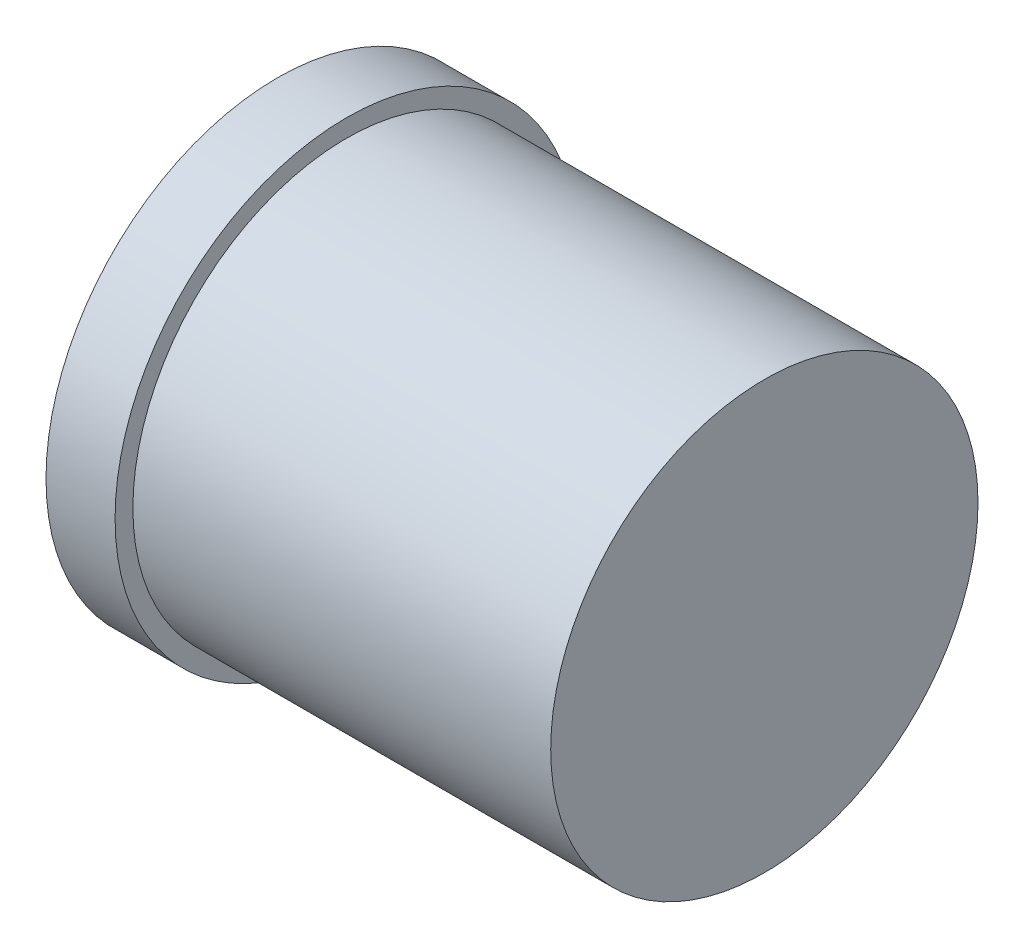
ISO-10303-21;
HEADER;
FILE_DESCRIPTION(('STEP AP214'),'2;1');
FILE_NAME('part.step','',(''),(''),'','','');
FILE_SCHEMA(('AUTOMOTIVE_DESIGN { 1 0 10303 214 1 1 1 1 }'));
ENDSEC;
DATA;
#1=APPLICATION_CONTEXT('core data for automotive mechanical design processes');
#2=APPLICATION_PROTOCOL_DEFINITION('international standard','automotive_design',2000,#1);
#3=PRODUCT_CONTEXT('',#1,'mechanical');
#4=PRODUCT('Part','Part','',(#3));
#5=PRODUCT_RELATED_PRODUCT_CATEGORY('part','',(#4));
#6=PRODUCT_DEFINITION_FORMATION('','',#4);
#7=PRODUCT_DEFINITION_CONTEXT('part definition',#1,'design');
#8=PRODUCT_DEFINITION('design','',#6,#7);
#9=PRODUCT_DEFINITION_SHAPE('','',#8);
#10=(LENGTH_UNIT() NAMED_UNIT(*) SI_UNIT(.MILLI.,.METRE.));
#11=(NAMED_UNIT(*) PLANE_ANGLE_UNIT() SI_UNIT($,.RADIAN.));
#12=(NAMED_UNIT(*) SI_UNIT($,.STERADIAN.) SOLID_ANGLE_UNIT());
#13=UNCERTAINTY_MEASURE_WITH_UNIT(LENGTH_MEASURE(1.E-05),#10,'distance_accuracy_value','');
#14=(GEOMETRIC_REPRESENTATION_CONTEXT(3) GLOBAL_UNCERTAINTY_ASSIGNED_CONTEXT((#13)) GLOBAL_UNIT_ASSIGNED_CONTEXT((#10,
#11,#12)) REPRESENTATION_CONTEXT('',''));
#15=CARTESIAN_POINT('',(0.,0.,0.));
#16=DIRECTION('',(0.,0.,1.));
#17=DIRECTION('',(1.,0.,0.));
#18=AXIS2_PLACEMENT_3D('',#15,#16,#17);
#19=CARTESIAN_POINT('',(41.2369,0.,0.));
#20=DIRECTION('',(-1.,0.,0.));
#21=DIRECTION('',(0.,0.,1.));
#22=AXIS2_PLACEMENT_3D('',#19,#20,#21);
#23=CYLINDRICAL_SURFACE('',#22,24.60625);
#24=CARTESIAN_POINT('',(41.2369,0.,0.));
#25=DIRECTION('',(-1.,0.,0.));
#26=DIRECTION('',(0.,0.,1.));
#27=AXIS2_PLACEMENT_3D('',#24,#25,#26);
#28=CIRCLE('',#27,24.60625);
#29=CARTESIAN_POINT('',(41.2369,24.5400751323728,-1.8034));
#30=VERTEX_POINT('',#29);
#31=CARTESIAN_POINT('',(41.2369,-24.5400751323728,-1.8034));
#32=VERTEX_POINT('',#31);
#33=EDGE_CURVE('E161',#30,#32,#28,.T.);
#34=ORIENTED_EDGE('',*,*,#33,.F.);
#35=DIRECTION('',(-1.,0.,0.));
#36=VECTOR('',#35,1.);
#37=CARTESIAN_POINT('',(41.2369,24.5400751323728,-1.8034));
#38=LINE('',#37,#36);
#39=CARTESIAN_POINT('',(39.4589,24.5400751323728,-1.8034));
#40=VERTEX_POINT('',#39);
#41=EDGE_CURVE('E149',#40,#30,#38,.F.);
#42=ORIENTED_EDGE('',*,*,#41,.F.);
#43=CARTESIAN_POINT('',(39.4589,0.,0.));
#44=DIRECTION('',(-1.,0.,0.));
#45=DIRECTION('',(0.,0.,1.));
#46=AXIS2_PLACEMENT_3D('',#43,#44,#45);
#47=CIRCLE('',#46,24.60625);
#48=CARTESIAN_POINT('',(39.4589,-24.5400751323728,-1.8034));
#49=VERTEX_POINT('',#48);
#50=EDGE_CURVE('E159',#40,#49,#47,.T.);
#51=ORIENTED_EDGE('',*,*,#50,.T.);
#52=DIRECTION('',(-1.,0.,0.));
#53=VECTOR('',#52,1.);
#54=CARTESIAN_POINT('',(41.2369,-24.5400751323728,-1.8034));
#55=LINE('',#54,#53);
#56=EDGE_CURVE('E284',#49,#32,#55,.F.);
#57=ORIENTED_EDGE('',*,*,#56,.T.);
#58=EDGE_LOOP('',(#34,#42,#51,#57));
#59=FACE_BOUND('',#58,.T.);
#60=ADVANCED_FACE('F34',(#59),#23,.F.);
#61=CARTESIAN_POINT('',(41.2369,0.,0.));
#62=DIRECTION('',(-1.,0.,0.));
#63=DIRECTION('',(0.,0.,1.));
#64=AXIS2_PLACEMENT_3D('',#61,#62,#63);
#65=PLANE('',#64);
#66=DIRECTION('',(0.,1.,0.));
#67=VECTOR('',#66,1.);
#68=CARTESIAN_POINT('',(41.2369,21.9605769207004,-1.8034));
#69=LINE('',#68,#67);
#70=CARTESIAN_POINT('',(41.2369,21.9605769207004,-1.8034));
#71=VERTEX_POINT('',#70);
#72=EDGE_CURVE('E49',#71,#30,#69,.T.);
#73=ORIENTED_EDGE('',*,*,#72,.T.);
#74=ORIENTED_EDGE('',*,*,#33,.T.);
#75=DIRECTION('',(0.,-1.,0.));
#76=VECTOR('',#75,1.);
#77=CARTESIAN_POINT('',(41.2369,-21.9605769207004,-1.8034));
#78=LINE('',#77,#76);
#79=CARTESIAN_POINT('',(41.2369,-21.9605769207004,-1.8034));
#80=VERTEX_POINT('',#79);
#81=EDGE_CURVE('E275',#80,#32,#78,.T.);
#82=ORIENTED_EDGE('',*,*,#81,.F.);
#83=CARTESIAN_POINT('',(41.2369,0.,0.));
#84=DIRECTION('',(-1.,0.,0.));
#85=DIRECTION('',(0.,0.,1.));
#86=AXIS2_PLACEMENT_3D('',#83,#84,#85);
#87=CIRCLE('',#86,22.0345);
#88=EDGE_CURVE('E260',#71,#80,#87,.T.);
#89=ORIENTED_EDGE('',*,*,#88,.F.);
#90=EDGE_LOOP('',(#73,#74,#82,#89));
#91=FACE_BOUND('',#90,.T.);
#92=ADVANCED_FACE('F276',(#91),#65,.T.);
#93=CARTESIAN_POINT('',(39.4589,0.,0.));
#94=DIRECTION('',(-1.,0.,0.));
#95=DIRECTION('',(0.,0.,1.));
#96=AXIS2_PLACEMENT_3D('',#93,#94,#95);
#97=PLANE('',#96);
#98=ORIENTED_EDGE('',*,*,#50,.F.);
#99=DIRECTION('',(0.,1.,0.));
#100=VECTOR('',#99,1.);
#101=CARTESIAN_POINT('',(39.4588999999996,21.9605769207004,-1.8034));
#102=LINE('',#101,#100);
#103=CARTESIAN_POINT('',(39.4588999999996,21.9605769207004,-1.8034));
#104=VERTEX_POINT('',#103);
#105=EDGE_CURVE('E146',#104,#40,#102,.T.);
#106=ORIENTED_EDGE('',*,*,#105,.F.);
#107=CARTESIAN_POINT('',(39.4589,0.,0.));
#108=DIRECTION('',(-1.,0.,0.));
#109=DIRECTION('',(0.,0.,1.));
#110=AXIS2_PLACEMENT_3D('',#107,#108,#109);
#111=CIRCLE('',#110,22.0345);
#112=CARTESIAN_POINT('',(39.4589,-21.9605769207004,-1.8034));
#113=VERTEX_POINT('',#112);
#114=EDGE_CURVE('E261',#104,#113,#111,.T.);
#115=ORIENTED_EDGE('',*,*,#114,.T.);
#116=DIRECTION('',(0.,-1.,0.));
#117=VECTOR('',#116,1.);
#118=CARTESIAN_POINT('',(39.4588999999996,-21.9605769207004,-1.8034));
#119=LINE('',#118,#117);
#120=EDGE_CURVE('E166',#113,#49,#119,.T.);
#121=ORIENTED_EDGE('',*,*,#120,.T.);
#122=EDGE_LOOP('',(#98,#106,#115,#121));
#123=FACE_BOUND('',#122,.T.);
#124=ADVANCED_FACE('F164',(#123),#97,.F.);
#125=CARTESIAN_POINT('',(39.4589,-24.5400751323728,1.8034));
#126=VERTEX_POINT('',#125);
#127=CARTESIAN_POINT('',(39.4589,24.5400751323728,1.8034));
#128=VERTEX_POINT('',#127);
#129=EDGE_CURVE('E168',#126,#128,#47,.T.);
#130=ORIENTED_EDGE('',*,*,#129,.T.);
#131=DIRECTION('',(-1.,0.,0.));
#132=VECTOR('',#131,1.);
#133=CARTESIAN_POINT('',(41.2369,24.5400751323728,1.8034));
#134=LINE('',#133,#132);
#135=CARTESIAN_POINT('',(41.2369,24.5400751323728,1.8034));
#136=VERTEX_POINT('',#135);
#137=EDGE_CURVE('E154',#136,#128,#134,.T.);
#138=ORIENTED_EDGE('',*,*,#137,.F.);
#139=CARTESIAN_POINT('',(41.2369,-24.5400751323728,1.8034));
#140=VERTEX_POINT('',#139);
#141=EDGE_CURVE('E177',#140,#136,#28,.T.);
#142=ORIENTED_EDGE('',*,*,#141,.F.);
#143=DIRECTION('',(-1.,0.,0.));
#144=VECTOR('',#143,1.);
#145=CARTESIAN_POINT('',(41.2369,-24.5400751323728,1.8034));
#146=LINE('',#145,#144);
#147=EDGE_CURVE('E338',#140,#126,#146,.T.);
#148=ORIENTED_EDGE('',*,*,#147,.T.);
#149=EDGE_LOOP('',(#130,#138,#142,#148));
#150=FACE_BOUND('',#149,.T.);
#151=ADVANCED_FACE('F320',(#150),#23,.F.);
#152=DIRECTION('',(0.,-1.,0.));
#153=VECTOR('',#152,1.);
#154=CARTESIAN_POINT('',(41.2369,21.9605769207004,1.8034));
#155=LINE('',#154,#153);
#156=CARTESIAN_POINT('',(41.2369,21.9605769207004,1.8034));
#157=VERTEX_POINT('',#156);
#158=EDGE_CURVE('E355',#136,#157,#155,.T.);
#159=ORIENTED_EDGE('',*,*,#158,.T.);
#160=CARTESIAN_POINT('',(41.2369,-21.9605769207004,1.8034));
#161=VERTEX_POINT('',#160);
#162=EDGE_CURVE('E185',#161,#157,#87,.T.);
#163=ORIENTED_EDGE('',*,*,#162,.F.);
#164=DIRECTION('',(0.,1.,0.));
#165=VECTOR('',#164,1.);
#166=CARTESIAN_POINT('',(41.2369,-21.9605769207004,1.8034));
#167=LINE('',#166,#165);
#168=EDGE_CURVE('E57',#140,#161,#167,.T.);
#169=ORIENTED_EDGE('',*,*,#168,.F.);
#170=ORIENTED_EDGE('',*,*,#141,.T.);
#171=EDGE_LOOP('',(#159,#163,#169,#170));
#172=FACE_BOUND('',#171,.T.);
#173=ADVANCED_FACE('F325',(#172),#65,.T.);
#174=CARTESIAN_POINT('',(39.4588999999996,-21.9605769207004,1.8034));
#175=VERTEX_POINT('',#174);
#176=CARTESIAN_POINT('',(39.4588999999996,21.9605769207004,1.8034));
#177=VERTEX_POINT('',#176);
#178=EDGE_CURVE('E258',#175,#177,#111,.T.);
#179=ORIENTED_EDGE('',*,*,#178,.T.);
#180=DIRECTION('',(0.,-1.,0.));
#181=VECTOR('',#180,1.);
#182=CARTESIAN_POINT('',(39.4588999999996,21.9605769207004,1.8034));
#183=LINE('',#182,#181);
#184=EDGE_CURVE('E345',#128,#177,#183,.T.);
#185=ORIENTED_EDGE('',*,*,#184,.F.);
#186=ORIENTED_EDGE('',*,*,#129,.F.);
#187=DIRECTION('',(0.,1.,0.));
#188=VECTOR('',#187,1.);
#189=CARTESIAN_POINT('',(39.4588999999996,-21.9605769207004,1.8034));
#190=LINE('',#189,#188);
#191=EDGE_CURVE('E343',#126,#175,#190,.T.);
#192=ORIENTED_EDGE('',*,*,#191,.T.);
#193=EDGE_LOOP('',(#179,#185,#186,#192));
#194=FACE_BOUND('',#193,.T.);
#195=ADVANCED_FACE('F334',(#194),#97,.F.);
#196=CARTESIAN_POINT('',(0.,0.,0.));
#197=DIRECTION('',(-1.,0.,0.));
#198=DIRECTION('',(0.,0.,1.));
#199=AXIS2_PLACEMENT_3D('',#196,#197,#198);
#200=PLANE('',#199);
#201=CARTESIAN_POINT('',(0.,0.,0.));
#202=DIRECTION('',(1.,0.,0.));
#203=DIRECTION('',(0.,0.,-1.));
#204=AXIS2_PLACEMENT_3D('',#201,#202,#203);
#205=CIRCLE('',#204,27.7271723065599);
#206=CARTESIAN_POINT('',(0.,27.6449603934905,2.1336));
#207=VERTEX_POINT('',#206);
#208=CARTESIAN_POINT('',(0.,-27.6449603934905,2.1336));
#209=VERTEX_POINT('',#208);
#210=EDGE_CURVE('E252',#207,#209,#205,.T.);
#211=ORIENTED_EDGE('',*,*,#210,.T.);
#212=DIRECTION('',(0.,1.,0.));
#213=VECTOR('',#212,1.);
#214=CARTESIAN_POINT('',(0.,-21.9309585127965,2.1336));
#215=LINE('',#214,#213);
#216=CARTESIAN_POINT('',(0.,-21.9309585127965,2.1336));
#217=VERTEX_POINT('',#216);
#218=EDGE_CURVE('E191',#209,#217,#215,.T.);
#219=ORIENTED_EDGE('',*,*,#218,.T.);
#220=CARTESIAN_POINT('',(0.,0.,0.));
#221=DIRECTION('',(-1.,0.,0.));
#222=DIRECTION('',(0.,0.,1.));
#223=AXIS2_PLACEMENT_3D('',#220,#221,#222);
#224=CIRCLE('',#223,22.0345);
#225=CARTESIAN_POINT('',(0.,21.9309585127965,2.1336));
#226=VERTEX_POINT('',#225);
#227=EDGE_CURVE('E248',#217,#226,#224,.T.);
#228=ORIENTED_EDGE('',*,*,#227,.T.);
#229=DIRECTION('',(0.,-1.,0.));
#230=VECTOR('',#229,1.);
#231=CARTESIAN_POINT('',(0.,21.9309585127965,2.1336));
#232=LINE('',#231,#230);
#233=EDGE_CURVE('E221',#207,#226,#232,.T.);
#234=ORIENTED_EDGE('',*,*,#233,.F.);
#235=EDGE_LOOP('',(#211,#219,#228,#234));
#236=FACE_BOUND('',#235,.T.);
#237=ADVANCED_FACE('F499',(#236),#200,.F.);
#238=CARTESIAN_POINT('',(26.9875,0.,0.));
#239=DIRECTION('',(-1.,0.,0.));
#240=DIRECTION('',(0.,0.,1.));
#241=AXIS2_PLACEMENT_3D('',#238,#239,#240);
#242=CYLINDRICAL_SURFACE('',#241,27.7271723065599);
#243=DIRECTION('',(-1.,0.,0.));
#244=VECTOR('',#243,1.);
#245=CARTESIAN_POINT('',(26.9875,-27.6449603934905,2.1336));
#246=LINE('',#245,#244);
#247=CARTESIAN_POINT('',(2.3876,-27.6449603934905,2.1336));
#248=VERTEX_POINT('',#247);
#249=EDGE_CURVE('E213',#209,#248,#246,.F.);
#250=ORIENTED_EDGE('',*,*,#249,.F.);
#251=ORIENTED_EDGE('',*,*,#210,.F.);
#252=DIRECTION('',(-1.,0.,0.));
#253=VECTOR('',#252,1.);
#254=CARTESIAN_POINT('',(26.9875,27.6449603934905,2.1336));
#255=LINE('',#254,#253);
#256=CARTESIAN_POINT('',(2.3876,27.6449603934905,2.1336));
#257=VERTEX_POINT('',#256);
#258=EDGE_CURVE('E236',#207,#257,#255,.F.);
#259=ORIENTED_EDGE('',*,*,#258,.T.);
#260=CARTESIAN_POINT('',(2.3876,0.,0.));
#261=DIRECTION('',(-1.,0.,0.));
#262=DIRECTION('',(0.,0.,1.));
#263=AXIS2_PLACEMENT_3D('',#260,#261,#262);
#264=CIRCLE('',#263,27.7271723065599);
#265=CARTESIAN_POINT('',(2.3876,27.6449603934905,-2.1336));
#266=VERTEX_POINT('',#265);
#267=EDGE_CURVE('E255',#257,#266,#264,.T.);
#268=ORIENTED_EDGE('',*,*,#267,.T.);
#269=DIRECTION('',(-1.,0.,0.));
#270=VECTOR('',#269,1.);
#271=CARTESIAN_POINT('',(26.9875,27.6449603934905,-2.1336));
#272=LINE('',#271,#270);
#273=CARTESIAN_POINT('',(0.,27.6449603934905,-2.1336));
#274=VERTEX_POINT('',#273);
#275=EDGE_CURVE('E239',#266,#274,#272,.T.);
#276=ORIENTED_EDGE('',*,*,#275,.T.);
#277=CARTESIAN_POINT('',(0.,-27.6449603934905,-2.1336));
#278=VERTEX_POINT('',#277);
#279=EDGE_CURVE('E251',#278,#274,#205,.T.);
#280=ORIENTED_EDGE('',*,*,#279,.F.);
#281=DIRECTION('',(-1.,0.,0.));
#282=VECTOR('',#281,1.);
#283=CARTESIAN_POINT('',(26.9875,-27.6449603934905,-2.1336));
#284=LINE('',#283,#282);
#285=CARTESIAN_POINT('',(2.3876,-27.6449603934905,-2.1336));
#286=VERTEX_POINT('',#285);
#287=EDGE_CURVE('E210',#286,#278,#284,.T.);
#288=ORIENTED_EDGE('',*,*,#287,.F.);
#289=CARTESIAN_POINT('',(2.3876,0.,0.));
#290=DIRECTION('',(-1.,0.,0.));
#291=DIRECTION('',(0.,0.,1.));
#292=AXIS2_PLACEMENT_3D('',#289,#290,#291);
#293=CIRCLE('',#292,27.7271723065599);
#294=EDGE_CURVE('E42',#286,#248,#293,.T.);
#295=ORIENTED_EDGE('',*,*,#294,.T.);
#296=EDGE_LOOP('',(#250,#251,#259,#268,#276,#280,#288,#295));
#297=FACE_BOUND('',#296,.T.);
#298=CARTESIAN_POINT('',(26.9875,0.,0.));
#299=DIRECTION('',(1.,0.,0.));
#300=DIRECTION('',(0.,0.,-1.));
#301=AXIS2_PLACEMENT_3D('',#298,#299,#300);
#302=CIRCLE('',#301,27.7271723065599);
#303=CARTESIAN_POINT('',(26.9875,0.,-27.7271723065599));
#304=VERTEX_POINT('',#303);
#305=EDGE_CURVE('E245',#304,#304,#302,.T.);
#306=ORIENTED_EDGE('',*,*,#305,.T.);
#307=EDGE_LOOP('',(#306));
#308=FACE_BOUND('',#307,.T.);
#309=ADVANCED_FACE('F671',(#297,#308),#242,.F.);
#310=CARTESIAN_POINT('',(0.,21.9309585127965,-2.1336));
#311=VERTEX_POINT('',#310);
#312=CARTESIAN_POINT('',(0.,-21.9309585127965,-2.1336));
#313=VERTEX_POINT('',#312);
#314=EDGE_CURVE('E249',#311,#313,#224,.T.);
#315=ORIENTED_EDGE('',*,*,#314,.T.);
#316=DIRECTION('',(0.,-1.,0.));
#317=VECTOR('',#316,1.);
#318=CARTESIAN_POINT('',(0.,-21.9309585127965,-2.1336));
#319=LINE('',#318,#317);
#320=EDGE_CURVE('E196',#313,#278,#319,.T.);
#321=ORIENTED_EDGE('',*,*,#320,.T.);
#322=ORIENTED_EDGE('',*,*,#279,.T.);
#323=DIRECTION('',(0.,1.,0.));
#324=VECTOR('',#323,1.);
#325=CARTESIAN_POINT('',(0.,21.9309585127965,-2.1336));
#326=LINE('',#325,#324);
#327=EDGE_CURVE('E216',#311,#274,#326,.T.);
#328=ORIENTED_EDGE('',*,*,#327,.F.);
#329=EDGE_LOOP('',(#315,#321,#322,#328));
#330=FACE_BOUND('',#329,.T.);
#331=ADVANCED_FACE('F660',(#330),#200,.F.);
#332=CARTESIAN_POINT('',(-5.5118,0.,0.));
#333=DIRECTION('',(1.,0.,0.));
#334=DIRECTION('',(0.,0.,-1.));
#335=AXIS2_PLACEMENT_3D('',#332,#333,#334);
#336=CYLINDRICAL_SURFACE('',#335,22.0345);
#337=CARTESIAN_POINT('',(-5.5118,0.,0.));
#338=DIRECTION('',(-1.,0.,0.));
#339=DIRECTION('',(0.,0.,1.));
#340=AXIS2_PLACEMENT_3D('',#337,#338,#339);
#341=CIRCLE('',#340,22.0345);
#342=CARTESIAN_POINT('',(-5.5118,0.,22.0345));
#343=VERTEX_POINT('',#342);
#344=EDGE_CURVE('E188',#343,#343,#341,.T.);
#345=ORIENTED_EDGE('',*,*,#344,.T.);
#346=EDGE_LOOP('',(#345));
#347=FACE_BOUND('',#346,.T.);
#348=ORIENTED_EDGE('',*,*,#314,.F.);
#349=DIRECTION('',(-1.,0.,0.));
#350=VECTOR('',#349,1.);
#351=CARTESIAN_POINT('',(2.3876,21.9309585127965,-2.1336));
#352=LINE('',#351,#350);
#353=CARTESIAN_POINT('',(2.3876,21.9309585127965,-2.1336));
#354=VERTEX_POINT('',#353);
#355=EDGE_CURVE('E233',#354,#311,#352,.T.);
#356=ORIENTED_EDGE('',*,*,#355,.F.);
#357=CARTESIAN_POINT('',(2.3876,0.,0.));
#358=DIRECTION('',(-1.,0.,0.));
#359=DIRECTION('',(0.,0.,1.));
#360=AXIS2_PLACEMENT_3D('',#357,#358,#359);
#361=CIRCLE('',#360,22.0345);
#362=CARTESIAN_POINT('',(2.3876,21.9309585127965,2.1336));
#363=VERTEX_POINT('',#362);
#364=EDGE_CURVE('E217',#363,#354,#361,.T.);
#365=ORIENTED_EDGE('',*,*,#364,.F.);
#366=DIRECTION('',(-1.,0.,0.));
#367=VECTOR('',#366,1.);
#368=CARTESIAN_POINT('',(2.3876,21.9309585127965,2.1336));
#369=LINE('',#368,#367);
#370=EDGE_CURVE('E226',#363,#226,#369,.T.);
#371=ORIENTED_EDGE('',*,*,#370,.T.);
#372=ORIENTED_EDGE('',*,*,#227,.F.);
#373=DIRECTION('',(-1.,0.,0.));
#374=VECTOR('',#373,1.);
#375=CARTESIAN_POINT('',(2.3876,-21.9309585127965,2.1336));
#376=LINE('',#375,#374);
#377=CARTESIAN_POINT('',(2.3876,-21.9309585127965,2.1336));
#378=VERTEX_POINT('',#377);
#379=EDGE_CURVE('E207',#378,#217,#376,.T.);
#380=ORIENTED_EDGE('',*,*,#379,.F.);
#381=CARTESIAN_POINT('',(2.3876,0.,0.));
#382=DIRECTION('',(1.,0.,0.));
#383=DIRECTION('',(0.,0.,1.));
#384=AXIS2_PLACEMENT_3D('',#381,#382,#383);
#385=CIRCLE('',#384,22.0345);
#386=CARTESIAN_POINT('',(2.3876,-21.9309585127965,-2.1336));
#387=VERTEX_POINT('',#386);
#388=EDGE_CURVE('E192',#378,#387,#385,.T.);
#389=ORIENTED_EDGE('',*,*,#388,.T.);
#390=DIRECTION('',(-1.,0.,0.));
#391=VECTOR('',#390,1.);
#392=CARTESIAN_POINT('',(2.3876,-21.9309585127965,-2.1336));
#393=LINE('',#392,#391);
#394=EDGE_CURVE('E201',#387,#313,#393,.T.);
#395=ORIENTED_EDGE('',*,*,#394,.T.);
#396=EDGE_LOOP('',(#348,#356,#365,#371,#372,#380,#389,#395));
#397=FACE_BOUND('',#396,.T.);
#398=ADVANCED_FACE('F655',(#347,#397),#336,.F.);
#399=CARTESIAN_POINT('',(26.9875,0.,0.));
#400=DIRECTION('',(1.,0.,0.));
#401=DIRECTION('',(0.,0.,-1.));
#402=AXIS2_PLACEMENT_3D('',#399,#400,#401);
#403=PLANE('',#402);
#404=ORIENTED_EDGE('',*,*,#305,.F.);
#405=EDGE_LOOP('',(#404));
#406=FACE_BOUND('',#405,.T.);
#407=CARTESIAN_POINT('',(26.9875,0.,0.));
#408=DIRECTION('',(1.,0.,0.));
#409=DIRECTION('',(0.,0.,-1.));
#410=AXIS2_PLACEMENT_3D('',#407,#408,#409);
#411=CIRCLE('',#410,22.0345);
#412=CARTESIAN_POINT('',(26.9875,0.,-22.0345));
#413=VERTEX_POINT('',#412);
#414=EDGE_CURVE('E242',#413,#413,#411,.T.);
#415=ORIENTED_EDGE('',*,*,#414,.T.);
#416=EDGE_LOOP('',(#415));
#417=FACE_BOUND('',#416,.T.);
#418=ADVANCED_FACE('F517',(#406,#417),#403,.F.);
#419=CARTESIAN_POINT('',(53.975,0.,0.));
#420=DIRECTION('',(-1.,0.,0.));
#421=DIRECTION('',(0.,0.,1.));
#422=AXIS2_PLACEMENT_3D('',#419,#420,#421);
#423=CYLINDRICAL_SURFACE('',#422,22.0345);
#424=ORIENTED_EDGE('',*,*,#114,.F.);
#425=DIRECTION('',(1.,0.,0.));
#426=VECTOR('',#425,1.);
#427=CARTESIAN_POINT('',(-500000.,21.9605769207004,-1.8034));
#428=LINE('',#427,#426);
#429=EDGE_CURVE('E150',#104,#71,#428,.T.);
#430=ORIENTED_EDGE('',*,*,#429,.T.);
#431=ORIENTED_EDGE('',*,*,#88,.T.);
#432=DIRECTION('',(1.,0.,0.));
#433=VECTOR('',#432,1.);
#434=CARTESIAN_POINT('',(-500000.,-21.9605769207004,-1.8034));
#435=LINE('',#434,#433);
#436=EDGE_CURVE('E272',#113,#80,#435,.T.);
#437=ORIENTED_EDGE('',*,*,#436,.F.);
#438=EDGE_LOOP('',(#424,#430,#431,#437));
#439=FACE_BOUND('',#438,.T.);
#440=ORIENTED_EDGE('',*,*,#178,.F.);
#441=DIRECTION('',(1.,0.,0.));
#442=VECTOR('',#441,1.);
#443=CARTESIAN_POINT('',(-500000.,-21.9605769207004,1.8034));
#444=LINE('',#443,#442);
#445=EDGE_CURVE('E281',#175,#161,#444,.T.);
#446=ORIENTED_EDGE('',*,*,#445,.T.);
#447=ORIENTED_EDGE('',*,*,#162,.T.);
#448=DIRECTION('',(1.,0.,0.));
#449=VECTOR('',#448,1.);
#450=CARTESIAN_POINT('',(-500000.,21.9605769207004,1.8034));
#451=LINE('',#450,#449);
#452=EDGE_CURVE('E162',#177,#157,#451,.T.);
#453=ORIENTED_EDGE('',*,*,#452,.F.);
#454=EDGE_LOOP('',(#440,#446,#447,#453));
#455=FACE_BOUND('',#454,.T.);
#456=ORIENTED_EDGE('',*,*,#414,.F.);
#457=EDGE_LOOP('',(#456));
#458=FACE_BOUND('',#457,.T.);
#459=CARTESIAN_POINT('',(53.975,0.,0.));
#460=DIRECTION('',(1.,0.,0.));
#461=DIRECTION('',(0.,0.,-1.));
#462=AXIS2_PLACEMENT_3D('',#459,#460,#461);
#463=CIRCLE('',#462,22.0345);
#464=CARTESIAN_POINT('',(53.975,0.,-22.0345));
#465=VERTEX_POINT('',#464);
#466=EDGE_CURVE('E169',#465,#465,#463,.T.);
#467=ORIENTED_EDGE('',*,*,#466,.T.);
#468=EDGE_LOOP('',(#467));
#469=FACE_BOUND('',#468,.T.);
#470=ADVANCED_FACE('F270',(#439,#455,#458,#469),#423,.F.);
#471=CARTESIAN_POINT('',(2.3876,21.9309585127965,-2.1336));
#472=DIRECTION('',(0.,0.,1.));
#473=DIRECTION('',(0.,-1.,0.));
#474=AXIS2_PLACEMENT_3D('',#471,#472,#473);
#475=PLANE('',#474);
#476=ORIENTED_EDGE('',*,*,#275,.F.);
#477=DIRECTION('',(0.,1.,0.));
#478=VECTOR('',#477,1.);
#479=CARTESIAN_POINT('',(2.3876,21.9309585127965,-2.1336));
#480=LINE('',#479,#478);
#481=EDGE_CURVE('E220',#354,#266,#480,.T.);
#482=ORIENTED_EDGE('',*,*,#481,.F.);
#483=ORIENTED_EDGE('',*,*,#355,.T.);
#484=ORIENTED_EDGE('',*,*,#327,.T.);
#485=EDGE_LOOP('',(#476,#482,#483,#484));
#486=FACE_BOUND('',#485,.T.);
#487=ADVANCED_FACE('F516',(#486),#475,.F.);
#488=CARTESIAN_POINT('',(2.3876,21.9309585127965,2.1336));
#489=DIRECTION('',(0.,0.,-1.));
#490=DIRECTION('',(0.,1.,0.));
#491=AXIS2_PLACEMENT_3D('',#488,#489,#490);
#492=PLANE('',#491);
#493=ORIENTED_EDGE('',*,*,#258,.F.);
#494=ORIENTED_EDGE('',*,*,#233,.T.);
#495=ORIENTED_EDGE('',*,*,#370,.F.);
#496=DIRECTION('',(0.,-1.,0.));
#497=VECTOR('',#496,1.);
#498=CARTESIAN_POINT('',(2.3876,21.9309585127965,2.1336));
#499=LINE('',#498,#497);
#500=EDGE_CURVE('E224',#257,#363,#499,.T.);
#501=ORIENTED_EDGE('',*,*,#500,.F.);
#502=EDGE_LOOP('',(#493,#494,#495,#501));
#503=FACE_BOUND('',#502,.T.);
#504=ADVANCED_FACE('F558',(#503),#492,.F.);
#505=CARTESIAN_POINT('',(2.3876,0.,0.));
#506=DIRECTION('',(-1.,0.,0.));
#507=DIRECTION('',(0.,0.,1.));
#508=AXIS2_PLACEMENT_3D('',#505,#506,#507);
#509=PLANE('',#508);
#510=ORIENTED_EDGE('',*,*,#267,.F.);
#511=ORIENTED_EDGE('',*,*,#500,.T.);
#512=ORIENTED_EDGE('',*,*,#364,.T.);
#513=ORIENTED_EDGE('',*,*,#481,.T.);
#514=EDGE_LOOP('',(#510,#511,#512,#513));
#515=FACE_BOUND('',#514,.T.);
#516=ADVANCED_FACE('F566',(#515),#509,.F.);
#517=CARTESIAN_POINT('',(2.3876,-21.9309585127965,2.1336));
#518=DIRECTION('',(0.,0.,1.));
#519=DIRECTION('',(0.,-1.,0.));
#520=AXIS2_PLACEMENT_3D('',#517,#518,#519);
#521=PLANE('',#520);
#522=ORIENTED_EDGE('',*,*,#218,.F.);
#523=ORIENTED_EDGE('',*,*,#249,.T.);
#524=DIRECTION('',(0.,1.,0.));
#525=VECTOR('',#524,1.);
#526=CARTESIAN_POINT('',(2.3876,-21.9309585127965,2.1336));
#527=LINE('',#526,#525);
#528=EDGE_CURVE('E195',#248,#378,#527,.T.);
#529=ORIENTED_EDGE('',*,*,#528,.T.);
#530=ORIENTED_EDGE('',*,*,#379,.T.);
#531=EDGE_LOOP('',(#522,#523,#529,#530));
#532=FACE_BOUND('',#531,.T.);
#533=ADVANCED_FACE('F574',(#532),#521,.T.);
#534=CARTESIAN_POINT('',(2.3876,-21.9309585127965,-2.1336));
#535=DIRECTION('',(0.,0.,-1.));
#536=DIRECTION('',(0.,1.,0.));
#537=AXIS2_PLACEMENT_3D('',#534,#535,#536);
#538=PLANE('',#537);
#539=DIRECTION('',(0.,-1.,0.));
#540=VECTOR('',#539,1.);
#541=CARTESIAN_POINT('',(2.3876,-21.9309585127965,-2.1336));
#542=LINE('',#541,#540);
#543=EDGE_CURVE('E198',#387,#286,#542,.T.);
#544=ORIENTED_EDGE('',*,*,#543,.T.);
#545=ORIENTED_EDGE('',*,*,#287,.T.);
#546=ORIENTED_EDGE('',*,*,#320,.F.);
#547=ORIENTED_EDGE('',*,*,#394,.F.);
#548=EDGE_LOOP('',(#544,#545,#546,#547));
#549=FACE_BOUND('',#548,.T.);
#550=ADVANCED_FACE('F583',(#549),#538,.T.);
#551=CARTESIAN_POINT('',(2.3876,0.,0.));
#552=DIRECTION('',(-1.,0.,0.));
#553=DIRECTION('',(0.,0.,1.));
#554=AXIS2_PLACEMENT_3D('',#551,#552,#553);
#555=PLANE('',#554);
#556=ORIENTED_EDGE('',*,*,#294,.F.);
#557=ORIENTED_EDGE('',*,*,#543,.F.);
#558=ORIENTED_EDGE('',*,*,#388,.F.);
#559=ORIENTED_EDGE('',*,*,#528,.F.);
#560=EDGE_LOOP('',(#556,#557,#558,#559));
#561=FACE_BOUND('',#560,.T.);
#562=ADVANCED_FACE('F592',(#561),#555,.F.);
#563=CARTESIAN_POINT('',(-7.7216,0.,0.));
#564=DIRECTION('',(-1.,0.,0.));
#565=DIRECTION('',(0.,0.,1.));
#566=AXIS2_PLACEMENT_3D('',#563,#564,#565);
#567=PLANE('',#566);
#568=CARTESIAN_POINT('',(-7.7216,0.,0.));
#569=DIRECTION('',(-1.,0.,0.));
#570=DIRECTION('',(0.,0.,1.));
#571=AXIS2_PLACEMENT_3D('',#568,#569,#570);
#572=CIRCLE('',#571,31.75);
#573=CARTESIAN_POINT('',(-7.7216,0.,-31.75));
#574=VERTEX_POINT('',#573);
#575=EDGE_CURVE('E11',#574,#574,#572,.F.);
#576=ORIENTED_EDGE('',*,*,#575,.F.);
#577=EDGE_LOOP('',(#576));
#578=FACE_BOUND('',#577,.T.);
#579=CARTESIAN_POINT('',(-7.7216,0.,0.));
#580=DIRECTION('',(-1.,0.,0.));
#581=DIRECTION('',(0.,0.,1.));
#582=AXIS2_PLACEMENT_3D('',#579,#580,#581);
#583=CIRCLE('',#582,17.526);
#584=CARTESIAN_POINT('',(-7.7216,0.,17.526));
#585=VERTEX_POINT('',#584);
#586=EDGE_CURVE('E178',#585,#585,#583,.T.);
#587=ORIENTED_EDGE('',*,*,#586,.F.);
#588=EDGE_LOOP('',(#587));
#589=FACE_BOUND('',#588,.T.);
#590=ADVANCED_FACE('F451',(#578,#589),#567,.T.);
#591=CARTESIAN_POINT('',(-5.5118,0.,0.));
#592=DIRECTION('',(-1.,0.,0.));
#593=DIRECTION('',(0.,0.,1.));
#594=AXIS2_PLACEMENT_3D('',#591,#592,#593);
#595=PLANE('',#594);
#596=ORIENTED_EDGE('',*,*,#344,.F.);
#597=EDGE_LOOP('',(#596));
#598=FACE_BOUND('',#597,.T.);
#599=CARTESIAN_POINT('',(-5.5118,0.,0.));
#600=DIRECTION('',(-1.,0.,0.));
#601=DIRECTION('',(0.,0.,1.));
#602=AXIS2_PLACEMENT_3D('',#599,#600,#601);
#603=CIRCLE('',#602,17.526);
#604=CARTESIAN_POINT('',(-5.5118,0.,17.526));
#605=VERTEX_POINT('',#604);
#606=EDGE_CURVE('E182',#605,#605,#603,.T.);
#607=ORIENTED_EDGE('',*,*,#606,.T.);
#608=EDGE_LOOP('',(#607));
#609=FACE_BOUND('',#608,.T.);
#610=ADVANCED_FACE('F606',(#598,#609),#595,.F.);
#611=CARTESIAN_POINT('',(-7.7216,0.,0.));
#612=DIRECTION('',(1.,0.,0.));
#613=DIRECTION('',(0.,0.,-1.));
#614=AXIS2_PLACEMENT_3D('',#611,#612,#613);
#615=CYLINDRICAL_SURFACE('',#614,17.526);
#616=ORIENTED_EDGE('',*,*,#586,.T.);
#617=EDGE_LOOP('',(#616));
#618=FACE_BOUND('',#617,.T.);
#619=ORIENTED_EDGE('',*,*,#606,.F.);
#620=EDGE_LOOP('',(#619));
#621=FACE_BOUND('',#620,.T.);
#622=ADVANCED_FACE('F315',(#618,#621),#615,.F.);
#623=CARTESIAN_POINT('',(53.975,0.,0.));
#624=DIRECTION('',(1.,0.,0.));
#625=DIRECTION('',(0.,0.,-1.));
#626=AXIS2_PLACEMENT_3D('',#623,#624,#625);
#627=PLANE('',#626);
#628=ORIENTED_EDGE('',*,*,#466,.F.);
#629=EDGE_LOOP('',(#628));
#630=FACE_BOUND('',#629,.T.);
#631=CARTESIAN_POINT('',(53.975,0.,0.));
#632=DIRECTION('',(1.,0.,0.));
#633=DIRECTION('',(0.,0.,-1.));
#634=AXIS2_PLACEMENT_3D('',#631,#632,#633);
#635=CIRCLE('',#634,6.5151);
#636=CARTESIAN_POINT('',(53.975,0.,-6.5151));
#637=VERTEX_POINT('',#636);
#638=EDGE_CURVE('E173',#637,#637,#635,.T.);
#639=ORIENTED_EDGE('',*,*,#638,.T.);
#640=EDGE_LOOP('',(#639));
#641=FACE_BOUND('',#640,.T.);
#642=ADVANCED_FACE('F301',(#630,#641),#627,.F.);
#643=CARTESIAN_POINT('',(59.944,0.,0.));
#644=DIRECTION('',(-1.,0.,0.));
#645=DIRECTION('',(0.,0.,1.));
#646=AXIS2_PLACEMENT_3D('',#643,#644,#645);
#647=CYLINDRICAL_SURFACE('',#646,6.5151);
#648=CARTESIAN_POINT('',(59.944,0.,0.));
#649=DIRECTION('',(1.,0.,0.));
#650=DIRECTION('',(0.,0.,-1.));
#651=AXIS2_PLACEMENT_3D('',#648,#649,#650);
#652=CIRCLE('',#651,6.5151);
#653=CARTESIAN_POINT('',(59.944,0.,-6.5151));
#654=VERTEX_POINT('',#653);
#655=EDGE_CURVE('E295',#654,#654,#652,.T.);
#656=ORIENTED_EDGE('',*,*,#655,.T.);
#657=EDGE_LOOP('',(#656));
#658=FACE_BOUND('',#657,.T.);
#659=ORIENTED_EDGE('',*,*,#638,.F.);
#660=EDGE_LOOP('',(#659));
#661=FACE_BOUND('',#660,.T.);
#662=ADVANCED_FACE('F303',(#658,#661),#647,.F.);
#663=CARTESIAN_POINT('',(59.944,0.,0.));
#664=DIRECTION('',(1.,0.,0.));
#665=DIRECTION('',(0.,0.,-1.));
#666=AXIS2_PLACEMENT_3D('',#663,#664,#665);
#667=PLANE('',#666);
#668=ORIENTED_EDGE('',*,*,#655,.F.);
#669=EDGE_LOOP('',(#668));
#670=FACE_BOUND('',#669,.T.);
#671=CARTESIAN_POINT('',(59.944,0.,0.));
#672=DIRECTION('',(1.,0.,0.));
#673=DIRECTION('',(0.,0.,-1.));
#674=AXIS2_PLACEMENT_3D('',#671,#672,#673);
#675=CIRCLE('',#674,5.0165);
#676=CARTESIAN_POINT('',(59.944,0.,-5.0165));
#677=VERTEX_POINT('',#676);
#678=EDGE_CURVE('E292',#677,#677,#675,.T.);
#679=ORIENTED_EDGE('',*,*,#678,.T.);
#680=EDGE_LOOP('',(#679));
#681=FACE_BOUND('',#680,.T.);
#682=ADVANCED_FACE('F305',(#670,#681),#667,.F.);
#683=CARTESIAN_POINT('',(65.2018,0.,0.));
#684=DIRECTION('',(-1.,0.,0.));
#685=DIRECTION('',(0.,0.,1.));
#686=AXIS2_PLACEMENT_3D('',#683,#684,#685);
#687=CYLINDRICAL_SURFACE('',#686,5.0165);
#688=CARTESIAN_POINT('',(65.2018,0.,0.));
#689=DIRECTION('',(1.,0.,0.));
#690=DIRECTION('',(0.,0.,-1.));
#691=AXIS2_PLACEMENT_3D('',#688,#689,#690);
#692=CIRCLE('',#691,5.0165);
#693=CARTESIAN_POINT('',(65.2018,0.,-5.0165));
#694=VERTEX_POINT('',#693);
#695=EDGE_CURVE('E289',#694,#694,#692,.T.);
#696=ORIENTED_EDGE('',*,*,#695,.T.);
#697=EDGE_LOOP('',(#696));
#698=FACE_BOUND('',#697,.T.);
#699=ORIENTED_EDGE('',*,*,#678,.F.);
#700=EDGE_LOOP('',(#699));
#701=FACE_BOUND('',#700,.T.);
#702=ADVANCED_FACE('F312',(#698,#701),#687,.F.);
#703=CARTESIAN_POINT('',(65.2018,0.,0.));
#704=DIRECTION('',(1.,0.,0.));
#705=DIRECTION('',(0.,0.,-1.));
#706=AXIS2_PLACEMENT_3D('',#703,#704,#705);
#707=PLANE('',#706);
#708=ORIENTED_EDGE('',*,*,#695,.F.);
#709=EDGE_LOOP('',(#708));
#710=FACE_BOUND('',#709,.T.);
#711=ADVANCED_FACE('F398',(#710),#707,.F.);
#712=CARTESIAN_POINT('',(-500000.,-21.9605769207004,-1.8034));
#713=DIRECTION('',(0.,0.,1.));
#714=DIRECTION('',(0.,-1.,0.));
#715=AXIS2_PLACEMENT_3D('',#712,#713,#714);
#716=PLANE('',#715);
#717=ORIENTED_EDGE('',*,*,#120,.F.);
#718=ORIENTED_EDGE('',*,*,#436,.T.);
#719=ORIENTED_EDGE('',*,*,#81,.T.);
#720=ORIENTED_EDGE('',*,*,#56,.F.);
#721=EDGE_LOOP('',(#717,#718,#719,#720));
#722=FACE_BOUND('',#721,.T.);
#723=ADVANCED_FACE('F280',(#722),#716,.F.);
#724=CARTESIAN_POINT('',(-500000.,-21.9605769207004,1.8034));
#725=DIRECTION('',(0.,0.,-1.));
#726=DIRECTION('',(0.,1.,0.));
#727=AXIS2_PLACEMENT_3D('',#724,#725,#726);
#728=PLANE('',#727);
#729=ORIENTED_EDGE('',*,*,#191,.F.);
#730=ORIENTED_EDGE('',*,*,#147,.F.);
#731=ORIENTED_EDGE('',*,*,#168,.T.);
#732=ORIENTED_EDGE('',*,*,#445,.F.);
#733=EDGE_LOOP('',(#729,#730,#731,#732));
#734=FACE_BOUND('',#733,.T.);
#735=ADVANCED_FACE('F347',(#734),#728,.F.);
#736=CARTESIAN_POINT('',(-500000.,21.9605769207004,-1.8034));
#737=DIRECTION('',(0.,0.,-1.));
#738=DIRECTION('',(0.,1.,0.));
#739=AXIS2_PLACEMENT_3D('',#736,#737,#738);
#740=PLANE('',#739);
#741=ORIENTED_EDGE('',*,*,#429,.F.);
#742=ORIENTED_EDGE('',*,*,#105,.T.);
#743=ORIENTED_EDGE('',*,*,#41,.T.);
#744=ORIENTED_EDGE('',*,*,#72,.F.);
#745=EDGE_LOOP('',(#741,#742,#743,#744));
#746=FACE_BOUND('',#745,.T.);
#747=ADVANCED_FACE('F148',(#746),#740,.T.);
#748=CARTESIAN_POINT('',(-500000.,21.9605769207004,1.8034));
#749=DIRECTION('',(0.,0.,1.));
#750=DIRECTION('',(0.,-1.,0.));
#751=AXIS2_PLACEMENT_3D('',#748,#749,#750);
#752=PLANE('',#751);
#753=ORIENTED_EDGE('',*,*,#137,.T.);
#754=ORIENTED_EDGE('',*,*,#184,.T.);
#755=ORIENTED_EDGE('',*,*,#452,.T.);
#756=ORIENTED_EDGE('',*,*,#158,.F.);
#757=EDGE_LOOP('',(#753,#754,#755,#756));
#758=FACE_BOUND('',#757,.T.);
#759=ADVANCED_FACE('F386',(#758),#752,.T.);
#760=CARTESIAN_POINT('',(-7.7216,0.,0.));
#761=DIRECTION('',(-1.,0.,0.));
#762=DIRECTION('',(0.,0.,1.));
#763=AXIS2_PLACEMENT_3D('',#760,#761,#762);
#764=PLANE('',#763);
#765=CARTESIAN_POINT('',(-7.7216,0.,0.));
#766=DIRECTION('',(-1.,0.,0.));
#767=DIRECTION('',(0.,0.,1.));
#768=AXIS2_PLACEMENT_3D('',#765,#766,#767);
#769=CIRCLE('',#768,41.275);
#770=CARTESIAN_POINT('',(-7.7216,0.,-41.275));
#771=VERTEX_POINT('',#770);
#772=EDGE_CURVE('E362',#771,#771,#769,.T.);
#773=ORIENTED_EDGE('',*,*,#772,.F.);
#774=EDGE_LOOP('',(#773));
#775=FACE_BOUND('',#774,.T.);
#776=CARTESIAN_POINT('',(-7.7216,0.,0.));
#777=DIRECTION('',(-1.,0.,0.));
#778=DIRECTION('',(0.,0.,1.));
#779=AXIS2_PLACEMENT_3D('',#776,#777,#778);
#780=CIRCLE('',#779,38.1);
#781=CARTESIAN_POINT('',(-7.7216,0.,38.1));
#782=VERTEX_POINT('',#781);
#783=EDGE_CURVE('E181',#782,#782,#780,.T.);
#784=ORIENTED_EDGE('',*,*,#783,.T.);
#785=EDGE_LOOP('',(#784));
#786=FACE_BOUND('',#785,.T.);
#787=ADVANCED_FACE('F377',(#775,#786),#764,.F.);
#788=CARTESIAN_POINT('',(-20.0406,0.,0.));
#789=DIRECTION('',(-1.,0.,0.));
#790=DIRECTION('',(0.,0.,1.));
#791=AXIS2_PLACEMENT_3D('',#788,#789,#790);
#792=PLANE('',#791);
#793=CARTESIAN_POINT('',(-20.0406,0.,0.));
#794=DIRECTION('',(-1.,0.,0.));
#795=DIRECTION('',(0.,0.,1.));
#796=AXIS2_PLACEMENT_3D('',#793,#794,#795);
#797=CIRCLE('',#796,41.275);
#798=CARTESIAN_POINT('',(-20.0406,0.,-41.275));
#799=VERTEX_POINT('',#798);
#800=EDGE_CURVE('E360',#799,#799,#797,.T.);
#801=ORIENTED_EDGE('',*,*,#800,.T.);
#802=EDGE_LOOP('',(#801));
#803=FACE_BOUND('',#802,.T.);
#804=CARTESIAN_POINT('',(-20.0406,0.,0.));
#805=DIRECTION('',(-1.,0.,0.));
#806=DIRECTION('',(0.,0.,1.));
#807=AXIS2_PLACEMENT_3D('',#804,#805,#806);
#808=CIRCLE('',#807,31.75);
#809=CARTESIAN_POINT('',(-20.0406,0.,-31.75));
#810=VERTEX_POINT('',#809);
#811=EDGE_CURVE('E365',#810,#810,#808,.T.);
#812=ORIENTED_EDGE('',*,*,#811,.F.);
#813=EDGE_LOOP('',(#812));
#814=FACE_BOUND('',#813,.T.);
#815=ADVANCED_FACE('F374',(#803,#814),#792,.T.);
#816=CARTESIAN_POINT('',(-20.0406,0.,0.));
#817=DIRECTION('',(1.,0.,0.));
#818=DIRECTION('',(0.,0.,-1.));
#819=AXIS2_PLACEMENT_3D('',#816,#817,#818);
#820=CYLINDRICAL_SURFACE('',#819,41.275);
#821=CARTESIAN_POINT('',(-20.0406,0.,-41.275));
#822=CARTESIAN_POINT('',(-19.9122770833333,0.,-41.275));
#823=CARTESIAN_POINT('',(-19.7839541666667,0.,-41.275));
#824=CARTESIAN_POINT('',(-19.5273083333333,0.,-41.275));
#825=CARTESIAN_POINT('',(-19.3989854166667,0.,-41.275));
#826=CARTESIAN_POINT('',(-19.1423395833333,0.,-41.275));
#827=CARTESIAN_POINT('',(-19.0140166666667,0.,-41.275));
#828=CARTESIAN_POINT('',(-18.7573708333333,0.,-41.275));
#829=CARTESIAN_POINT('',(-18.6290479166667,0.,-41.275));
#830=CARTESIAN_POINT('',(-18.3724020833333,0.,-41.275));
#831=CARTESIAN_POINT('',(-18.2440791666667,0.,-41.275));
#832=CARTESIAN_POINT('',(-17.9874333333333,0.,-41.275));
#833=CARTESIAN_POINT('',(-17.8591104166667,0.,-41.275));
#834=CARTESIAN_POINT('',(-17.6024645833333,0.,-41.275));
#835=CARTESIAN_POINT('',(-17.4741416666667,0.,-41.275));
#836=CARTESIAN_POINT('',(-17.2174958333333,0.,-41.275));
#837=CARTESIAN_POINT('',(-17.0891729166667,0.,-41.275));
#838=CARTESIAN_POINT('',(-16.8325270833333,0.,-41.275));
#839=CARTESIAN_POINT('',(-16.7042041666667,0.,-41.275));
#840=CARTESIAN_POINT('',(-16.4475583333333,0.,-41.275));
#841=CARTESIAN_POINT('',(-16.3192354166667,0.,-41.275));
#842=CARTESIAN_POINT('',(-16.0625895833333,0.,-41.275));
#843=CARTESIAN_POINT('',(-15.9342666666667,0.,-41.275));
#844=CARTESIAN_POINT('',(-15.6776208333333,0.,-41.275));
#845=CARTESIAN_POINT('',(-15.5492979166667,0.,-41.275));
#846=CARTESIAN_POINT('',(-15.2926520833333,0.,-41.275));
#847=CARTESIAN_POINT('',(-15.1643291666667,0.,-41.275));
#848=CARTESIAN_POINT('',(-14.9076833333333,0.,-41.275));
#849=CARTESIAN_POINT('',(-14.7793604166667,0.,-41.275));
#850=CARTESIAN_POINT('',(-14.5227145833333,0.,-41.275));
#851=CARTESIAN_POINT('',(-14.3943916666667,0.,-41.275));
#852=CARTESIAN_POINT('',(-14.1377458333333,0.,-41.275));
#853=CARTESIAN_POINT('',(-14.0094229166667,0.,-41.275));
#854=CARTESIAN_POINT('',(-13.7527770833333,0.,-41.275));
#855=CARTESIAN_POINT('',(-13.6244541666667,0.,-41.275));
#856=CARTESIAN_POINT('',(-13.3678083333333,0.,-41.275));
#857=CARTESIAN_POINT('',(-13.2394854166667,0.,-41.275));
#858=CARTESIAN_POINT('',(-12.9828395833333,0.,-41.275));
#859=CARTESIAN_POINT('',(-12.8545166666667,0.,-41.275));
#860=CARTESIAN_POINT('',(-12.5978708333333,0.,-41.275));
#861=CARTESIAN_POINT('',(-12.4695479166667,0.,-41.275));
#862=CARTESIAN_POINT('',(-12.2129020833333,0.,-41.275));
#863=CARTESIAN_POINT('',(-12.0845791666667,0.,-41.275));
#864=CARTESIAN_POINT('',(-11.8279333333333,0.,-41.275));
#865=CARTESIAN_POINT('',(-11.6996104166667,0.,-41.275));
#866=CARTESIAN_POINT('',(-11.4429645833333,0.,-41.275));
#867=CARTESIAN_POINT('',(-11.3146416666667,0.,-41.275));
#868=CARTESIAN_POINT('',(-11.0579958333333,0.,-41.275));
#869=CARTESIAN_POINT('',(-10.9296729166667,0.,-41.275));
#870=CARTESIAN_POINT('',(-10.6730270833333,0.,-41.275));
#871=CARTESIAN_POINT('',(-10.5447041666667,0.,-41.275));
#872=CARTESIAN_POINT('',(-10.2880583333333,0.,-41.275));
#873=CARTESIAN_POINT('',(-10.1597354166667,0.,-41.275));
#874=CARTESIAN_POINT('',(-9.90308958333333,0.,-41.275));
#875=CARTESIAN_POINT('',(-9.77476666666667,0.,-41.275));
#876=CARTESIAN_POINT('',(-9.51812083333333,0.,-41.275));
#877=CARTESIAN_POINT('',(-9.38979791666667,0.,-41.275));
#878=CARTESIAN_POINT('',(-9.13315208333333,0.,-41.275));
#879=CARTESIAN_POINT('',(-9.00482916666667,0.,-41.275));
#880=CARTESIAN_POINT('',(-8.74818333333334,0.,-41.275));
#881=CARTESIAN_POINT('',(-8.61986041666667,0.,-41.275));
#882=CARTESIAN_POINT('',(-8.36321458333333,0.,-41.275));
#883=CARTESIAN_POINT('',(-8.23489166666667,0.,-41.275));
#884=CARTESIAN_POINT('',(-7.97824583333334,0.,-41.275));
#885=CARTESIAN_POINT('',(-7.84992291666667,0.,-41.275));
#886=CARTESIAN_POINT('',(-7.7216,0.,-41.275));
#887=B_SPLINE_CURVE_WITH_KNOTS('',3,(#821,#822,#823,#824,#825,#826,#827,#828,#829,#830,#831,
#832,#833,#834,#835,#836,#837,#838,#839,#840,#841,#842,#843,#844,#845,#846,#847,#848,#849,#850,
#851,#852,#853,#854,#855,#856,#857,#858,#859,#860,#861,#862,#863,#864,#865,#866,#867,#868,#869,
#870,#871,#872,#873,#874,#875,#876,#877,#878,#879,#880,#881,#882,#883,#884,#885,#886),
.UNSPECIFIED.,.F.,.F.,(4,2,2,2,2,2,2,2,2,2,2,2,2,2,2,2,2,2,2,2,2,2,2,2,2,2,2,2,2,2,2,2,4),(0.,
0.384968749999999,0.769937499999998,1.15490625,1.539875,1.92484375,2.3098125,2.69478125,3.07975,
3.46471875,3.8496875,4.23465625,4.619625,5.00459375,5.3895625,5.77453125,6.1595,6.54446875,
6.9294375,7.31440625,7.699375,8.08434375,8.4693125,8.85428124999999,9.23924999999999,9.62421875,
10.0091875,10.39415625,10.779125,11.16409375,11.5490625,11.93403125,12.319),.UNSPECIFIED.);
#888=EDGE_CURVE('BSEAM376',#799,#771,#887,.T.);
#889=ORIENTED_EDGE('',*,*,#800,.F.);
#890=ORIENTED_EDGE('',*,*,#772,.T.);
#891=ORIENTED_EDGE('',*,*,#888,.T.);
#892=ORIENTED_EDGE('',*,*,#888,.F.);
#893=EDGE_LOOP('',(#889,#891,#890,#892));
#894=FACE_BOUND('',#893,.T.);
#895=ADVANCED_FACE('F376',(#894),#820,.T.);
#896=CARTESIAN_POINT('',(-20.0406,0.,0.));
#897=DIRECTION('',(1.,0.,0.));
#898=DIRECTION('',(0.,0.,-1.));
#899=AXIS2_PLACEMENT_3D('',#896,#897,#898);
#900=CYLINDRICAL_SURFACE('',#899,31.75);
#901=CARTESIAN_POINT('',(-20.0406,0.,-31.75));
#902=CARTESIAN_POINT('',(-19.9122770833333,0.,-31.75));
#903=CARTESIAN_POINT('',(-19.7839541666667,0.,-31.75));
#904=CARTESIAN_POINT('',(-19.5273083333333,0.,-31.75));
#905=CARTESIAN_POINT('',(-19.3989854166667,0.,-31.75));
#906=CARTESIAN_POINT('',(-19.1423395833333,0.,-31.75));
#907=CARTESIAN_POINT('',(-19.0140166666667,0.,-31.75));
#908=CARTESIAN_POINT('',(-18.7573708333333,0.,-31.75));
#909=CARTESIAN_POINT('',(-18.6290479166667,0.,-31.75));
#910=CARTESIAN_POINT('',(-18.3724020833333,0.,-31.75));
#911=CARTESIAN_POINT('',(-18.2440791666667,0.,-31.75));
#912=CARTESIAN_POINT('',(-17.9874333333333,0.,-31.75));
#913=CARTESIAN_POINT('',(-17.8591104166667,0.,-31.75));
#914=CARTESIAN_POINT('',(-17.6024645833333,0.,-31.75));
#915=CARTESIAN_POINT('',(-17.4741416666667,0.,-31.75));
#916=CARTESIAN_POINT('',(-17.2174958333333,0.,-31.75));
#917=CARTESIAN_POINT('',(-17.0891729166667,0.,-31.75));
#918=CARTESIAN_POINT('',(-16.8325270833333,0.,-31.75));
#919=CARTESIAN_POINT('',(-16.7042041666667,0.,-31.75));
#920=CARTESIAN_POINT('',(-16.4475583333333,0.,-31.75));
#921=CARTESIAN_POINT('',(-16.3192354166667,0.,-31.75));
#922=CARTESIAN_POINT('',(-16.0625895833333,0.,-31.75));
#923=CARTESIAN_POINT('',(-15.9342666666667,0.,-31.75));
#924=CARTESIAN_POINT('',(-15.6776208333333,0.,-31.75));
#925=CARTESIAN_POINT('',(-15.5492979166667,0.,-31.75));
#926=CARTESIAN_POINT('',(-15.2926520833333,0.,-31.75));
#927=CARTESIAN_POINT('',(-15.1643291666667,0.,-31.75));
#928=CARTESIAN_POINT('',(-14.9076833333333,0.,-31.75));
#929=CARTESIAN_POINT('',(-14.7793604166667,0.,-31.75));
#930=CARTESIAN_POINT('',(-14.5227145833333,0.,-31.75));
#931=CARTESIAN_POINT('',(-14.3943916666667,0.,-31.75));
#932=CARTESIAN_POINT('',(-14.1377458333333,0.,-31.75));
#933=CARTESIAN_POINT('',(-14.0094229166667,0.,-31.75));
#934=CARTESIAN_POINT('',(-13.7527770833333,0.,-31.75));
#935=CARTESIAN_POINT('',(-13.6244541666667,0.,-31.75));
#936=CARTESIAN_POINT('',(-13.3678083333333,0.,-31.75));
#937=CARTESIAN_POINT('',(-13.2394854166667,0.,-31.75));
#938=CARTESIAN_POINT('',(-12.9828395833333,0.,-31.75));
#939=CARTESIAN_POINT('',(-12.8545166666667,0.,-31.75));
#940=CARTESIAN_POINT('',(-12.5978708333333,0.,-31.75));
#941=CARTESIAN_POINT('',(-12.4695479166667,0.,-31.75));
#942=CARTESIAN_POINT('',(-12.2129020833333,0.,-31.75));
#943=CARTESIAN_POINT('',(-12.0845791666667,0.,-31.75));
#944=CARTESIAN_POINT('',(-11.8279333333333,0.,-31.75));
#945=CARTESIAN_POINT('',(-11.6996104166667,0.,-31.75));
#946=CARTESIAN_POINT('',(-11.4429645833333,0.,-31.75));
#947=CARTESIAN_POINT('',(-11.3146416666667,0.,-31.75));
#948=CARTESIAN_POINT('',(-11.0579958333333,0.,-31.75));
#949=CARTESIAN_POINT('',(-10.9296729166667,0.,-31.75));
#950=CARTESIAN_POINT('',(-10.6730270833333,0.,-31.75));
#951=CARTESIAN_POINT('',(-10.5447041666667,0.,-31.75));
#952=CARTESIAN_POINT('',(-10.2880583333333,0.,-31.75));
#953=CARTESIAN_POINT('',(-10.1597354166667,0.,-31.75));
#954=CARTESIAN_POINT('',(-9.90308958333333,0.,-31.75));
#955=CARTESIAN_POINT('',(-9.77476666666666,0.,-31.75));
#956=CARTESIAN_POINT('',(-9.51812083333333,0.,-31.75));
#957=CARTESIAN_POINT('',(-9.38979791666666,0.,-31.75));
#958=CARTESIAN_POINT('',(-9.13315208333333,0.,-31.75));
#959=CARTESIAN_POINT('',(-9.00482916666666,0.,-31.75));
#960=CARTESIAN_POINT('',(-8.74818333333333,0.,-31.75));
#961=CARTESIAN_POINT('',(-8.61986041666666,0.,-31.75));
#962=CARTESIAN_POINT('',(-8.36321458333333,0.,-31.75));
#963=CARTESIAN_POINT('',(-8.23489166666666,0.,-31.75));
#964=CARTESIAN_POINT('',(-7.97824583333333,0.,-31.75));
#965=CARTESIAN_POINT('',(-7.84992291666666,0.,-31.75));
#966=CARTESIAN_POINT('',(-7.7216,0.,-31.75));
#967=B_SPLINE_CURVE_WITH_KNOTS('',3,(#901,#902,#903,#904,#905,#906,#907,#908,#909,#910,#911,
#912,#913,#914,#915,#916,#917,#918,#919,#920,#921,#922,#923,#924,#925,#926,#927,#928,#929,#930,
#931,#932,#933,#934,#935,#936,#937,#938,#939,#940,#941,#942,#943,#944,#945,#946,#947,#948,#949,
#950,#951,#952,#953,#954,#955,#956,#957,#958,#959,#960,#961,#962,#963,#964,#965,#966),
.UNSPECIFIED.,.F.,.F.,(4,2,2,2,2,2,2,2,2,2,2,2,2,2,2,2,2,2,2,2,2,2,2,2,2,2,2,2,2,2,2,2,4),(0.,
0.384968750000003,0.769937500000001,1.15490625,1.539875,1.92484375,2.3098125,2.69478125,3.07975,
3.46471875,3.8496875,4.23465625,4.619625,5.00459375,5.3895625,5.77453125,6.1595,6.54446875,
6.9294375,7.31440625,7.699375,8.08434375,8.4693125,8.85428125,9.23925,9.62421875,10.0091875,
10.39415625,10.779125,11.16409375,11.5490625,11.93403125,12.319),.UNSPECIFIED.);
#968=EDGE_CURVE('BSEAM371',#810,#574,#967,.T.);
#969=ORIENTED_EDGE('',*,*,#811,.T.);
#970=ORIENTED_EDGE('',*,*,#575,.T.);
#971=ORIENTED_EDGE('',*,*,#968,.T.);
#972=ORIENTED_EDGE('',*,*,#968,.F.);
#973=EDGE_LOOP('',(#969,#971,#970,#972));
#974=FACE_BOUND('',#973,.T.);
#975=ADVANCED_FACE('F371',(#974),#900,.F.);
#976=CARTESIAN_POINT('',(66.7893,0.,0.));
#977=DIRECTION('',(1.,0.,0.));
#978=DIRECTION('',(0.,0.,-1.));
#979=AXIS2_PLACEMENT_3D('',#976,#977,#978);
#980=PLANE('',#979);
#981=CARTESIAN_POINT('',(66.7893,0.,0.));
#982=DIRECTION('',(1.,0.,0.));
#983=DIRECTION('',(0.,0.,-1.));
#984=AXIS2_PLACEMENT_3D('',#981,#982,#983);
#985=CIRCLE('',#984,38.1);
#986=CARTESIAN_POINT('',(66.7893,0.,-38.1));
#987=VERTEX_POINT('',#986);
#988=EDGE_CURVE('E278',#987,#987,#985,.T.);
#989=ORIENTED_EDGE('',*,*,#988,.T.);
#990=EDGE_LOOP('',(#989));
#991=FACE_BOUND('',#990,.T.);
#992=ADVANCED_FACE('F401',(#991),#980,.T.);
#993=CARTESIAN_POINT('',(26.9875,0.,0.));
#994=DIRECTION('',(-1.,0.,0.));
#995=DIRECTION('',(0.,0.,1.));
#996=AXIS2_PLACEMENT_3D('',#993,#994,#995);
#997=CYLINDRICAL_SURFACE('',#996,38.1);
#998=ORIENTED_EDGE('',*,*,#783,.F.);
#999=EDGE_LOOP('',(#998));
#1000=FACE_BOUND('',#999,.T.);
#1001=ORIENTED_EDGE('',*,*,#988,.F.);
#1002=EDGE_LOOP('',(#1001));
#1003=FACE_BOUND('',#1002,.T.);
#1004=ADVANCED_FACE('F36',(#1000,#1003),#997,.T.);
#1005=CLOSED_SHELL('',(#60,#92,#124,#151,#173,#195,#237,#309,#331,#398,#418,#470,#487,#504,#516,
#533,#550,#562,#590,#610,#622,#642,#662,#682,#702,#711,#723,#735,#747,#759,#787,#815,#895,#975,
#992,#1004));
#1006=MANIFOLD_SOLID_BREP('B2',#1005);
#1007=ADVANCED_BREP_SHAPE_REPRESENTATION('',(#18,#1006),#14);
#1008=SHAPE_DEFINITION_REPRESENTATION(#9,#1007);
ENDSEC;
END-ISO-10303-21;
